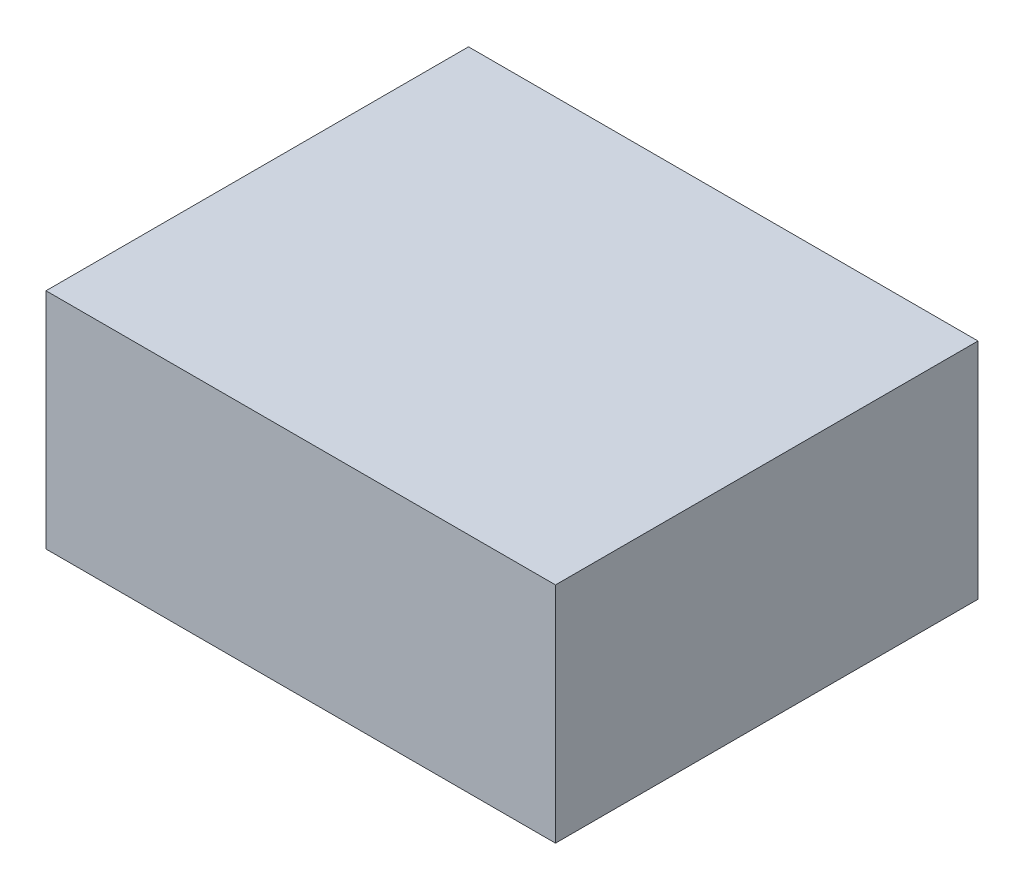
ISO-10303-21;
HEADER;
FILE_DESCRIPTION(('STEP AP214'),'2;1');
FILE_NAME('part.step','',(''),(''),'','','');
FILE_SCHEMA(('AUTOMOTIVE_DESIGN { 1 0 10303 214 1 1 1 1 }'));
ENDSEC;
DATA;
#1=APPLICATION_CONTEXT('core data for automotive mechanical design processes');
#2=APPLICATION_PROTOCOL_DEFINITION('international standard','automotive_design',2000,#1);
#3=PRODUCT_CONTEXT('',#1,'mechanical');
#4=PRODUCT('Part','Part','',(#3));
#5=PRODUCT_RELATED_PRODUCT_CATEGORY('part','',(#4));
#6=PRODUCT_DEFINITION_FORMATION('','',#4);
#7=PRODUCT_DEFINITION_CONTEXT('part definition',#1,'design');
#8=PRODUCT_DEFINITION('design','',#6,#7);
#9=PRODUCT_DEFINITION_SHAPE('','',#8);
#10=(LENGTH_UNIT() NAMED_UNIT(*) SI_UNIT(.MILLI.,.METRE.));
#11=(NAMED_UNIT(*) PLANE_ANGLE_UNIT() SI_UNIT($,.RADIAN.));
#12=(NAMED_UNIT(*) SI_UNIT($,.STERADIAN.) SOLID_ANGLE_UNIT());
#13=UNCERTAINTY_MEASURE_WITH_UNIT(LENGTH_MEASURE(1.E-05),#10,'distance_accuracy_value','');
#14=(GEOMETRIC_REPRESENTATION_CONTEXT(3) GLOBAL_UNCERTAINTY_ASSIGNED_CONTEXT((#13)) GLOBAL_UNIT_ASSIGNED_CONTEXT((#10,
#11,#12)) REPRESENTATION_CONTEXT('',''));
#15=CARTESIAN_POINT('',(0.,0.,0.));
#16=DIRECTION('',(0.,0.,1.));
#17=DIRECTION('',(1.,0.,0.));
#18=AXIS2_PLACEMENT_3D('',#15,#16,#17);
#19=CARTESIAN_POINT('',(0.,1.8,0.));
#20=DIRECTION('',(1.,0.,0.));
#21=DIRECTION('',(0.,0.,-1.));
#22=AXIS2_PLACEMENT_3D('',#19,#20,#21);
#23=PLANE('',#22);
#24=DIRECTION('',(0.,0.,1.));
#25=VECTOR('',#24,1.);
#26=CARTESIAN_POINT('',(0.,0.,0.));
#27=LINE('',#26,#25);
#28=CARTESIAN_POINT('',(0.,0.,-3.4));
#29=VERTEX_POINT('',#28);
#30=CARTESIAN_POINT('',(0.,0.,0.));
#31=VERTEX_POINT('',#30);
#32=EDGE_CURVE('E107',#29,#31,#27,.T.);
#33=ORIENTED_EDGE('',*,*,#32,.T.);
#34=DIRECTION('',(0.,-1.,0.));
#35=VECTOR('',#34,1.);
#36=CARTESIAN_POINT('',(0.,1.8,0.));
#37=LINE('',#36,#35);
#38=CARTESIAN_POINT('',(0.,1.8,0.));
#39=VERTEX_POINT('',#38);
#40=EDGE_CURVE('E11',#39,#31,#37,.T.);
#41=ORIENTED_EDGE('',*,*,#40,.F.);
#42=DIRECTION('',(0.,0.,1.));
#43=VECTOR('',#42,1.);
#44=CARTESIAN_POINT('',(0.,1.8,0.));
#45=LINE('',#44,#43);
#46=CARTESIAN_POINT('',(0.,1.8,-3.4));
#47=VERTEX_POINT('',#46);
#48=EDGE_CURVE('E91',#47,#39,#45,.T.);
#49=ORIENTED_EDGE('',*,*,#48,.F.);
#50=DIRECTION('',(0.,-1.,0.));
#51=VECTOR('',#50,1.);
#52=CARTESIAN_POINT('',(0.,1.8,-3.4));
#53=LINE('',#52,#51);
#54=EDGE_CURVE('E103',#47,#29,#53,.T.);
#55=ORIENTED_EDGE('',*,*,#54,.T.);
#56=EDGE_LOOP('',(#33,#41,#49,#55));
#57=FACE_BOUND('',#56,.T.);
#58=ADVANCED_FACE('F39',(#57),#23,.F.);
#59=CARTESIAN_POINT('',(0.,1.8,0.));
#60=DIRECTION('',(0.,0.,-1.));
#61=DIRECTION('',(-1.,0.,0.));
#62=AXIS2_PLACEMENT_3D('',#59,#60,#61);
#63=PLANE('',#62);
#64=DIRECTION('',(1.,0.,0.));
#65=VECTOR('',#64,1.);
#66=CARTESIAN_POINT('',(0.,0.,0.));
#67=LINE('',#66,#65);
#68=CARTESIAN_POINT('',(4.1,0.,0.));
#69=VERTEX_POINT('',#68);
#70=EDGE_CURVE('E96',#31,#69,#67,.T.);
#71=ORIENTED_EDGE('',*,*,#70,.T.);
#72=DIRECTION('',(0.,-1.,0.));
#73=VECTOR('',#72,1.);
#74=CARTESIAN_POINT('',(4.1,1.8,0.));
#75=LINE('',#74,#73);
#76=CARTESIAN_POINT('',(4.1,1.8,0.));
#77=VERTEX_POINT('',#76);
#78=EDGE_CURVE('E48',#77,#69,#75,.T.);
#79=ORIENTED_EDGE('',*,*,#78,.F.);
#80=DIRECTION('',(1.,0.,0.));
#81=VECTOR('',#80,1.);
#82=CARTESIAN_POINT('',(0.,1.8,0.));
#83=LINE('',#82,#81);
#84=EDGE_CURVE('E86',#39,#77,#83,.T.);
#85=ORIENTED_EDGE('',*,*,#84,.F.);
#86=ORIENTED_EDGE('',*,*,#40,.T.);
#87=EDGE_LOOP('',(#71,#79,#85,#86));
#88=FACE_BOUND('',#87,.T.);
#89=ADVANCED_FACE('F95',(#88),#63,.F.);
#90=CARTESIAN_POINT('',(4.1,1.8,0.));
#91=DIRECTION('',(-1.,0.,0.));
#92=DIRECTION('',(0.,0.,1.));
#93=AXIS2_PLACEMENT_3D('',#90,#91,#92);
#94=PLANE('',#93);
#95=DIRECTION('',(0.,0.,-1.));
#96=VECTOR('',#95,1.);
#97=CARTESIAN_POINT('',(4.1,0.,0.));
#98=LINE('',#97,#96);
#99=CARTESIAN_POINT('',(4.1,0.,-3.4));
#100=VERTEX_POINT('',#99);
#101=EDGE_CURVE('E73',#69,#100,#98,.T.);
#102=ORIENTED_EDGE('',*,*,#101,.T.);
#103=DIRECTION('',(0.,-1.,0.));
#104=VECTOR('',#103,1.);
#105=CARTESIAN_POINT('',(4.1,1.8,-3.4));
#106=LINE('',#105,#104);
#107=CARTESIAN_POINT('',(4.1,1.8,-3.4));
#108=VERTEX_POINT('',#107);
#109=EDGE_CURVE('E98',#108,#100,#106,.T.);
#110=ORIENTED_EDGE('',*,*,#109,.F.);
#111=DIRECTION('',(0.,0.,-1.));
#112=VECTOR('',#111,1.);
#113=CARTESIAN_POINT('',(4.1,1.8,0.));
#114=LINE('',#113,#112);
#115=EDGE_CURVE('E89',#77,#108,#114,.T.);
#116=ORIENTED_EDGE('',*,*,#115,.F.);
#117=ORIENTED_EDGE('',*,*,#78,.T.);
#118=EDGE_LOOP('',(#102,#110,#116,#117));
#119=FACE_BOUND('',#118,.T.);
#120=ADVANCED_FACE('F99',(#119),#94,.F.);
#121=CARTESIAN_POINT('',(0.,1.8,-3.4));
#122=DIRECTION('',(0.,0.,1.));
#123=DIRECTION('',(1.,0.,0.));
#124=AXIS2_PLACEMENT_3D('',#121,#122,#123);
#125=PLANE('',#124);
#126=DIRECTION('',(-1.,0.,0.));
#127=VECTOR('',#126,1.);
#128=CARTESIAN_POINT('',(0.,0.,-3.4));
#129=LINE('',#128,#127);
#130=EDGE_CURVE('E79',#100,#29,#129,.T.);
#131=ORIENTED_EDGE('',*,*,#130,.T.);
#132=ORIENTED_EDGE('',*,*,#54,.F.);
#133=DIRECTION('',(-1.,0.,0.));
#134=VECTOR('',#133,1.);
#135=CARTESIAN_POINT('',(0.,1.8,-3.4));
#136=LINE('',#135,#134);
#137=EDGE_CURVE('E56',#108,#47,#136,.T.);
#138=ORIENTED_EDGE('',*,*,#137,.F.);
#139=ORIENTED_EDGE('',*,*,#109,.T.);
#140=EDGE_LOOP('',(#131,#132,#138,#139));
#141=FACE_BOUND('',#140,.T.);
#142=ADVANCED_FACE('F120',(#141),#125,.F.);
#143=CARTESIAN_POINT('',(0.,1.8,0.));
#144=DIRECTION('',(0.,-1.,0.));
#145=DIRECTION('',(0.,0.,-1.));
#146=AXIS2_PLACEMENT_3D('',#143,#144,#145);
#147=PLANE('',#146);
#148=ORIENTED_EDGE('',*,*,#48,.T.);
#149=ORIENTED_EDGE('',*,*,#84,.T.);
#150=ORIENTED_EDGE('',*,*,#115,.T.);
#151=ORIENTED_EDGE('',*,*,#137,.T.);
#152=EDGE_LOOP('',(#148,#149,#150,#151));
#153=FACE_BOUND('',#152,.T.);
#154=ADVANCED_FACE('F87',(#153),#147,.F.);
#155=CARTESIAN_POINT('',(0.,0.,0.));
#156=DIRECTION('',(0.,-1.,0.));
#157=DIRECTION('',(0.,0.,-1.));
#158=AXIS2_PLACEMENT_3D('',#155,#156,#157);
#159=PLANE('',#158);
#160=ORIENTED_EDGE('',*,*,#32,.F.);
#161=ORIENTED_EDGE('',*,*,#130,.F.);
#162=ORIENTED_EDGE('',*,*,#101,.F.);
#163=ORIENTED_EDGE('',*,*,#70,.F.);
#164=EDGE_LOOP('',(#160,#161,#162,#163));
#165=FACE_BOUND('',#164,.T.);
#166=ADVANCED_FACE('F123',(#165),#159,.T.);
#167=CLOSED_SHELL('',(#58,#89,#120,#142,#154,#166));
#168=MANIFOLD_SOLID_BREP('B2',#167);
#169=ADVANCED_BREP_SHAPE_REPRESENTATION('',(#18,#168),#14);
#170=SHAPE_DEFINITION_REPRESENTATION(#9,#169);
ENDSEC;
END-ISO-10303-21;
